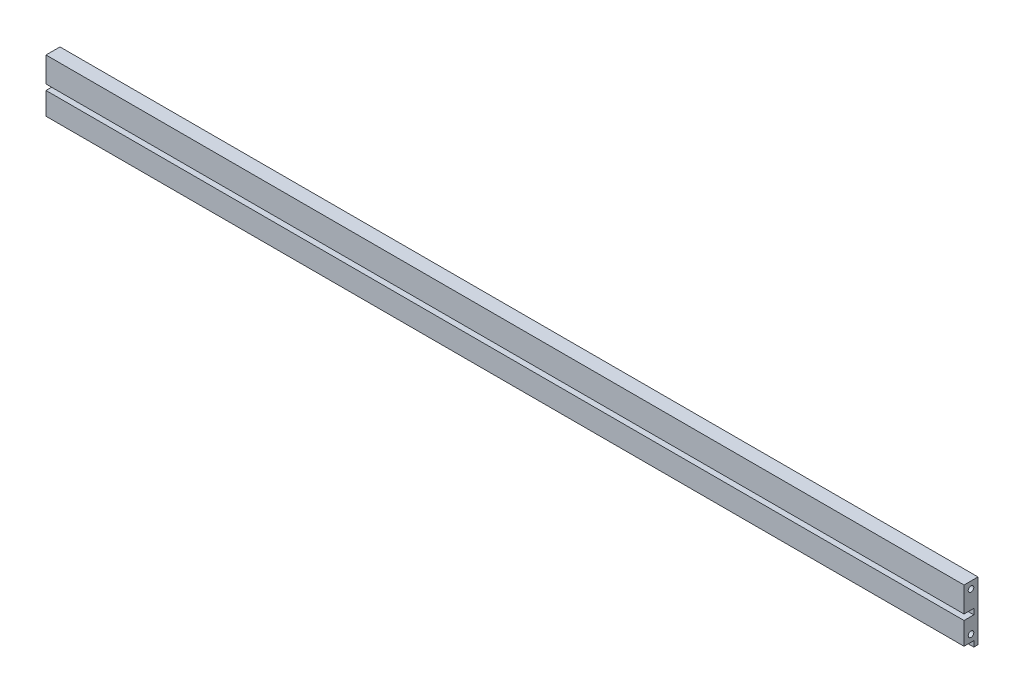
ISO-10303-21;
HEADER;
FILE_DESCRIPTION(('STEP AP214'),'2;1');
FILE_NAME('part.step','',(''),(''),'','','');
FILE_SCHEMA(('AUTOMOTIVE_DESIGN { 1 0 10303 214 1 1 1 1 }'));
ENDSEC;
DATA;
#1=APPLICATION_CONTEXT('core data for automotive mechanical design processes');
#2=APPLICATION_PROTOCOL_DEFINITION('international standard','automotive_design',2000,#1);
#3=PRODUCT_CONTEXT('',#1,'mechanical');
#4=PRODUCT('Part','Part','',(#3));
#5=PRODUCT_RELATED_PRODUCT_CATEGORY('part','',(#4));
#6=PRODUCT_DEFINITION_FORMATION('','',#4);
#7=PRODUCT_DEFINITION_CONTEXT('part definition',#1,'design');
#8=PRODUCT_DEFINITION('design','',#6,#7);
#9=PRODUCT_DEFINITION_SHAPE('','',#8);
#10=(LENGTH_UNIT() NAMED_UNIT(*) SI_UNIT(.MILLI.,.METRE.));
#11=(NAMED_UNIT(*) PLANE_ANGLE_UNIT() SI_UNIT($,.RADIAN.));
#12=(NAMED_UNIT(*) SI_UNIT($,.STERADIAN.) SOLID_ANGLE_UNIT());
#13=UNCERTAINTY_MEASURE_WITH_UNIT(LENGTH_MEASURE(1.E-05),#10,'distance_accuracy_value','');
#14=(GEOMETRIC_REPRESENTATION_CONTEXT(3) GLOBAL_UNCERTAINTY_ASSIGNED_CONTEXT((#13)) GLOBAL_UNIT_ASSIGNED_CONTEXT((#10,
#11,#12)) REPRESENTATION_CONTEXT('',''));
#15=CARTESIAN_POINT('',(0.,0.,0.));
#16=DIRECTION('',(0.,0.,1.));
#17=DIRECTION('',(1.,0.,0.));
#18=AXIS2_PLACEMENT_3D('',#15,#16,#17);
#19=CARTESIAN_POINT('',(47.3976987770359,-23.4062620209755,10.));
#20=DIRECTION('',(0.,1.,0.));
#21=DIRECTION('',(-1.,0.,0.));
#22=AXIS2_PLACEMENT_3D('',#19,#20,#21);
#23=PLANE('',#22);
#24=DIRECTION('',(1.,0.,0.));
#25=VECTOR('',#24,1.);
#26=CARTESIAN_POINT('',(-609.602301222964,-23.4062620209755,3.));
#27=LINE('',#26,#25);
#28=CARTESIAN_POINT('',(-609.602301222964,-23.4062620209755,3.));
#29=VERTEX_POINT('',#28);
#30=CARTESIAN_POINT('',(47.3976987770359,-23.4062620209755,3.));
#31=VERTEX_POINT('',#30);
#32=EDGE_CURVE('E121',#29,#31,#27,.T.);
#33=ORIENTED_EDGE('',*,*,#32,.F.);
#34=DIRECTION('',(0.,0.,-1.));
#35=VECTOR('',#34,1.);
#36=CARTESIAN_POINT('',(-609.602301222964,-23.4062620209755,10.));
#37=LINE('',#36,#35);
#38=CARTESIAN_POINT('',(-609.602301222964,-23.4062620209755,0.));
#39=VERTEX_POINT('',#38);
#40=EDGE_CURVE('E133',#29,#39,#37,.T.);
#41=ORIENTED_EDGE('',*,*,#40,.T.);
#42=DIRECTION('',(1.,0.,0.));
#43=VECTOR('',#42,1.);
#44=CARTESIAN_POINT('',(47.3976987770359,-23.4062620209755,0.));
#45=LINE('',#44,#43);
#46=CARTESIAN_POINT('',(47.3976987770359,-23.4062620209755,0.));
#47=VERTEX_POINT('',#46);
#48=EDGE_CURVE('E151',#39,#47,#45,.T.);
#49=ORIENTED_EDGE('',*,*,#48,.T.);
#50=DIRECTION('',(0.,0.,-1.));
#51=VECTOR('',#50,1.);
#52=CARTESIAN_POINT('',(47.3976987770359,-23.4062620209755,10.));
#53=LINE('',#52,#51);
#54=EDGE_CURVE('E135',#31,#47,#53,.T.);
#55=ORIENTED_EDGE('',*,*,#54,.F.);
#56=EDGE_LOOP('',(#33,#41,#49,#55));
#57=FACE_BOUND('',#56,.T.);
#58=ADVANCED_FACE('F39',(#57),#23,.F.);
#59=CARTESIAN_POINT('',(0.,0.,10.));
#60=DIRECTION('',(0.,0.,-1.));
#61=DIRECTION('',(-1.,0.,0.));
#62=AXIS2_PLACEMENT_3D('',#59,#60,#61);
#63=PLANE('',#62);
#64=DIRECTION('',(0.,-1.,0.));
#65=VECTOR('',#64,1.);
#66=CARTESIAN_POINT('',(-609.602301222964,18.5937379790245,10.));
#67=LINE('',#66,#65);
#68=CARTESIAN_POINT('',(-609.602301222964,18.5937379790245,10.));
#69=VERTEX_POINT('',#68);
#70=CARTESIAN_POINT('',(-609.602301222964,0.593737979024539,10.));
#71=VERTEX_POINT('',#70);
#72=EDGE_CURVE('E148',#69,#71,#67,.T.);
#73=ORIENTED_EDGE('',*,*,#72,.T.);
#74=DIRECTION('',(-1.,0.,0.));
#75=VECTOR('',#74,1.);
#76=CARTESIAN_POINT('',(-609.602301222964,0.593737979024539,10.));
#77=LINE('',#76,#75);
#78=CARTESIAN_POINT('',(47.3976987770359,0.593737979024539,10.));
#79=VERTEX_POINT('',#78);
#80=EDGE_CURVE('E189',#79,#71,#77,.T.);
#81=ORIENTED_EDGE('',*,*,#80,.F.);
#82=DIRECTION('',(0.,1.,0.));
#83=VECTOR('',#82,1.);
#84=CARTESIAN_POINT('',(47.3976987770359,18.5937379790245,10.));
#85=LINE('',#84,#83);
#86=CARTESIAN_POINT('',(47.3976987770359,18.5937379790245,10.));
#87=VERTEX_POINT('',#86);
#88=EDGE_CURVE('E154',#79,#87,#85,.T.);
#89=ORIENTED_EDGE('',*,*,#88,.T.);
#90=DIRECTION('',(-1.,0.,0.));
#91=VECTOR('',#90,1.);
#92=CARTESIAN_POINT('',(47.3976987770359,18.5937379790245,10.));
#93=LINE('',#92,#91);
#94=EDGE_CURVE('E169',#87,#69,#93,.T.);
#95=ORIENTED_EDGE('',*,*,#94,.T.);
#96=EDGE_LOOP('',(#73,#81,#89,#95));
#97=FACE_BOUND('',#96,.T.);
#98=ADVANCED_FACE('F312',(#97),#63,.F.);
#99=CARTESIAN_POINT('',(47.3976987770359,18.5937379790245,10.));
#100=DIRECTION('',(-1.,0.,0.));
#101=DIRECTION('',(0.,0.,1.));
#102=AXIS2_PLACEMENT_3D('',#99,#100,#101);
#103=PLANE('',#102);
#104=CARTESIAN_POINT('',(47.3976987770359,13.5937379790245,5.));
#105=DIRECTION('',(1.,0.,0.));
#106=DIRECTION('',(0.,0.,-1.));
#107=AXIS2_PLACEMENT_3D('',#104,#105,#106);
#108=CIRCLE('',#107,2.);
#109=CARTESIAN_POINT('',(47.3976987770359,13.5937379790245,3.));
#110=VERTEX_POINT('',#109);
#111=EDGE_CURVE('E245',#110,#110,#108,.T.);
#112=ORIENTED_EDGE('',*,*,#111,.F.);
#113=EDGE_LOOP('',(#112));
#114=FACE_BOUND('',#113,.T.);
#115=CARTESIAN_POINT('',(47.3976987770359,-14.4062620209755,5.));
#116=DIRECTION('',(1.,0.,0.));
#117=DIRECTION('',(0.,0.,-1.));
#118=AXIS2_PLACEMENT_3D('',#115,#116,#117);
#119=CIRCLE('',#118,2.);
#120=CARTESIAN_POINT('',(47.3976987770359,-14.4062620209755,3.));
#121=VERTEX_POINT('',#120);
#122=EDGE_CURVE('E236',#121,#121,#119,.T.);
#123=ORIENTED_EDGE('',*,*,#122,.F.);
#124=EDGE_LOOP('',(#123));
#125=FACE_BOUND('',#124,.T.);
#126=CARTESIAN_POINT('',(47.3976987770359,-19.4062620209755,10.));
#127=VERTEX_POINT('',#126);
#128=CARTESIAN_POINT('',(47.3976987770359,-3.40626202097546,10.));
#129=VERTEX_POINT('',#128);
#130=EDGE_CURVE('E172',#127,#129,#85,.T.);
#131=ORIENTED_EDGE('',*,*,#130,.F.);
#132=DIRECTION('',(0.,0.,1.));
#133=VECTOR('',#132,1.);
#134=CARTESIAN_POINT('',(47.3976987770359,-19.4062620209755,3.));
#135=LINE('',#134,#133);
#136=CARTESIAN_POINT('',(47.3976987770359,-19.4062620209755,3.));
#137=VERTEX_POINT('',#136);
#138=EDGE_CURVE('E63',#137,#127,#135,.T.);
#139=ORIENTED_EDGE('',*,*,#138,.F.);
#140=DIRECTION('',(0.,1.,0.));
#141=VECTOR('',#140,1.);
#142=CARTESIAN_POINT('',(47.3976987770359,-19.4062620209755,3.));
#143=LINE('',#142,#141);
#144=EDGE_CURVE('E137',#31,#137,#143,.T.);
#145=ORIENTED_EDGE('',*,*,#144,.F.);
#146=ORIENTED_EDGE('',*,*,#54,.T.);
#147=DIRECTION('',(0.,1.,0.));
#148=VECTOR('',#147,1.);
#149=CARTESIAN_POINT('',(47.3976987770359,18.5937379790245,0.));
#150=LINE('',#149,#148);
#151=CARTESIAN_POINT('',(47.3976987770359,18.5937379790245,0.));
#152=VERTEX_POINT('',#151);
#153=EDGE_CURVE('E160',#47,#152,#150,.T.);
#154=ORIENTED_EDGE('',*,*,#153,.T.);
#155=DIRECTION('',(0.,0.,-1.));
#156=VECTOR('',#155,1.);
#157=CARTESIAN_POINT('',(47.3976987770359,18.5937379790245,10.));
#158=LINE('',#157,#156);
#159=EDGE_CURVE('E11',#87,#152,#158,.T.);
#160=ORIENTED_EDGE('',*,*,#159,.F.);
#161=ORIENTED_EDGE('',*,*,#88,.F.);
#162=DIRECTION('',(0.,0.,1.));
#163=VECTOR('',#162,1.);
#164=CARTESIAN_POINT('',(47.3976987770359,0.593737979024539,3.));
#165=LINE('',#164,#163);
#166=CARTESIAN_POINT('',(47.3976987770359,0.593737979024539,3.));
#167=VERTEX_POINT('',#166);
#168=EDGE_CURVE('E182',#167,#79,#165,.T.);
#169=ORIENTED_EDGE('',*,*,#168,.F.);
#170=DIRECTION('',(0.,1.,0.));
#171=VECTOR('',#170,1.);
#172=CARTESIAN_POINT('',(47.3976987770359,-3.40626202097546,3.));
#173=LINE('',#172,#171);
#174=CARTESIAN_POINT('',(47.3976987770359,-3.40626202097546,3.));
#175=VERTEX_POINT('',#174);
#176=EDGE_CURVE('E200',#175,#167,#173,.T.);
#177=ORIENTED_EDGE('',*,*,#176,.F.);
#178=DIRECTION('',(0.,0.,1.));
#179=VECTOR('',#178,1.);
#180=CARTESIAN_POINT('',(47.3976987770359,-3.40626202097546,3.));
#181=LINE('',#180,#179);
#182=EDGE_CURVE('E177',#175,#129,#181,.T.);
#183=ORIENTED_EDGE('',*,*,#182,.T.);
#184=EDGE_LOOP('',(#131,#139,#145,#146,#154,#160,#161,#169,#177,#183));
#185=FACE_BOUND('',#184,.T.);
#186=ADVANCED_FACE('F41',(#114,#125,#185),#103,.F.);
#187=CARTESIAN_POINT('',(47.3976987770359,18.5937379790245,10.));
#188=DIRECTION('',(0.,-1.,0.));
#189=DIRECTION('',(1.,0.,0.));
#190=AXIS2_PLACEMENT_3D('',#187,#188,#189);
#191=PLANE('',#190);
#192=DIRECTION('',(-1.,0.,0.));
#193=VECTOR('',#192,1.);
#194=CARTESIAN_POINT('',(47.3976987770359,18.5937379790245,0.));
#195=LINE('',#194,#193);
#196=CARTESIAN_POINT('',(-609.602301222964,18.5937379790245,0.));
#197=VERTEX_POINT('',#196);
#198=EDGE_CURVE('E157',#152,#197,#195,.T.);
#199=ORIENTED_EDGE('',*,*,#198,.T.);
#200=DIRECTION('',(0.,0.,-1.));
#201=VECTOR('',#200,1.);
#202=CARTESIAN_POINT('',(-609.602301222964,18.5937379790245,10.));
#203=LINE('',#202,#201);
#204=EDGE_CURVE('E48',#69,#197,#203,.T.);
#205=ORIENTED_EDGE('',*,*,#204,.F.);
#206=ORIENTED_EDGE('',*,*,#94,.F.);
#207=ORIENTED_EDGE('',*,*,#159,.T.);
#208=EDGE_LOOP('',(#199,#205,#206,#207));
#209=FACE_BOUND('',#208,.T.);
#210=ADVANCED_FACE('F318',(#209),#191,.F.);
#211=CARTESIAN_POINT('',(-609.602301222964,18.5937379790245,10.));
#212=DIRECTION('',(1.,0.,0.));
#213=DIRECTION('',(0.,0.,-1.));
#214=AXIS2_PLACEMENT_3D('',#211,#212,#213);
#215=PLANE('',#214);
#216=CARTESIAN_POINT('',(-609.602301222964,13.5937379790245,5.));
#217=DIRECTION('',(-1.,0.,0.));
#218=DIRECTION('',(0.,0.,1.));
#219=AXIS2_PLACEMENT_3D('',#216,#217,#218);
#220=CIRCLE('',#219,2.);
#221=CARTESIAN_POINT('',(-609.602301222964,13.5937379790245,7.));
#222=VERTEX_POINT('',#221);
#223=EDGE_CURVE('E229',#222,#222,#220,.T.);
#224=ORIENTED_EDGE('',*,*,#223,.F.);
#225=EDGE_LOOP('',(#224));
#226=FACE_BOUND('',#225,.T.);
#227=CARTESIAN_POINT('',(-609.602301222964,-14.4062620209755,5.));
#228=DIRECTION('',(-1.,0.,0.));
#229=DIRECTION('',(0.,0.,1.));
#230=AXIS2_PLACEMENT_3D('',#227,#228,#229);
#231=CIRCLE('',#230,2.);
#232=CARTESIAN_POINT('',(-609.602301222964,-14.4062620209755,7.));
#233=VERTEX_POINT('',#232);
#234=EDGE_CURVE('E220',#233,#233,#231,.T.);
#235=ORIENTED_EDGE('',*,*,#234,.F.);
#236=EDGE_LOOP('',(#235));
#237=FACE_BOUND('',#236,.T.);
#238=DIRECTION('',(0.,-1.,0.));
#239=VECTOR('',#238,1.);
#240=CARTESIAN_POINT('',(-609.602301222964,-19.4062620209755,3.));
#241=LINE('',#240,#239);
#242=CARTESIAN_POINT('',(-609.602301222964,-19.4062620209755,3.));
#243=VERTEX_POINT('',#242);
#244=EDGE_CURVE('E118',#243,#29,#241,.T.);
#245=ORIENTED_EDGE('',*,*,#244,.F.);
#246=DIRECTION('',(0.,0.,1.));
#247=VECTOR('',#246,1.);
#248=CARTESIAN_POINT('',(-609.602301222964,-19.4062620209755,3.));
#249=LINE('',#248,#247);
#250=CARTESIAN_POINT('',(-609.602301222964,-19.4062620209755,10.));
#251=VERTEX_POINT('',#250);
#252=EDGE_CURVE('E164',#243,#251,#249,.T.);
#253=ORIENTED_EDGE('',*,*,#252,.T.);
#254=CARTESIAN_POINT('',(-609.602301222964,-3.40626202097546,10.));
#255=VERTEX_POINT('',#254);
#256=EDGE_CURVE('E168',#255,#251,#67,.T.);
#257=ORIENTED_EDGE('',*,*,#256,.F.);
#258=DIRECTION('',(0.,0.,1.));
#259=VECTOR('',#258,1.);
#260=CARTESIAN_POINT('',(-609.602301222964,-3.40626202097546,3.));
#261=LINE('',#260,#259);
#262=CARTESIAN_POINT('',(-609.602301222964,-3.40626202097546,3.));
#263=VERTEX_POINT('',#262);
#264=EDGE_CURVE('E55',#263,#255,#261,.T.);
#265=ORIENTED_EDGE('',*,*,#264,.F.);
#266=DIRECTION('',(0.,-1.,0.));
#267=VECTOR('',#266,1.);
#268=CARTESIAN_POINT('',(-609.602301222964,-3.40626202097546,3.));
#269=LINE('',#268,#267);
#270=CARTESIAN_POINT('',(-609.602301222964,0.593737979024539,3.));
#271=VERTEX_POINT('',#270);
#272=EDGE_CURVE('E192',#271,#263,#269,.T.);
#273=ORIENTED_EDGE('',*,*,#272,.F.);
#274=DIRECTION('',(0.,0.,1.));
#275=VECTOR('',#274,1.);
#276=CARTESIAN_POINT('',(-609.602301222964,0.593737979024539,3.));
#277=LINE('',#276,#275);
#278=EDGE_CURVE('E185',#271,#71,#277,.T.);
#279=ORIENTED_EDGE('',*,*,#278,.T.);
#280=ORIENTED_EDGE('',*,*,#72,.F.);
#281=ORIENTED_EDGE('',*,*,#204,.T.);
#282=DIRECTION('',(0.,-1.,0.));
#283=VECTOR('',#282,1.);
#284=CARTESIAN_POINT('',(-609.602301222964,18.5937379790245,0.));
#285=LINE('',#284,#283);
#286=EDGE_CURVE('E142',#197,#39,#285,.T.);
#287=ORIENTED_EDGE('',*,*,#286,.T.);
#288=ORIENTED_EDGE('',*,*,#40,.F.);
#289=EDGE_LOOP('',(#245,#253,#257,#265,#273,#279,#280,#281,#287,#288));
#290=FACE_BOUND('',#289,.T.);
#291=ADVANCED_FACE('F139',(#226,#237,#290),#215,.F.);
#292=ORIENTED_EDGE('',*,*,#256,.T.);
#293=DIRECTION('',(-1.,0.,0.));
#294=VECTOR('',#293,1.);
#295=CARTESIAN_POINT('',(-609.602301222964,-19.4062620209755,10.));
#296=LINE('',#295,#294);
#297=EDGE_CURVE('E128',#127,#251,#296,.T.);
#298=ORIENTED_EDGE('',*,*,#297,.F.);
#299=ORIENTED_EDGE('',*,*,#130,.T.);
#300=DIRECTION('',(1.,0.,0.));
#301=VECTOR('',#300,1.);
#302=CARTESIAN_POINT('',(-609.602301222964,-3.40626202097546,10.));
#303=LINE('',#302,#301);
#304=EDGE_CURVE('E193',#255,#129,#303,.T.);
#305=ORIENTED_EDGE('',*,*,#304,.F.);
#306=EDGE_LOOP('',(#292,#298,#299,#305));
#307=FACE_BOUND('',#306,.T.);
#308=ADVANCED_FACE('F298',(#307),#63,.F.);
#309=CARTESIAN_POINT('',(0.,0.,0.));
#310=DIRECTION('',(0.,0.,-1.));
#311=DIRECTION('',(-1.,0.,0.));
#312=AXIS2_PLACEMENT_3D('',#309,#310,#311);
#313=PLANE('',#312);
#314=ORIENTED_EDGE('',*,*,#153,.F.);
#315=ORIENTED_EDGE('',*,*,#48,.F.);
#316=ORIENTED_EDGE('',*,*,#286,.F.);
#317=ORIENTED_EDGE('',*,*,#198,.F.);
#318=EDGE_LOOP('',(#314,#315,#316,#317));
#319=FACE_BOUND('',#318,.T.);
#320=ADVANCED_FACE('F321',(#319),#313,.T.);
#321=CARTESIAN_POINT('',(-609.602301222964,0.593737979024539,3.));
#322=DIRECTION('',(0.,1.,0.));
#323=DIRECTION('',(0.,0.,1.));
#324=AXIS2_PLACEMENT_3D('',#321,#322,#323);
#325=PLANE('',#324);
#326=ORIENTED_EDGE('',*,*,#80,.T.);
#327=ORIENTED_EDGE('',*,*,#278,.F.);
#328=DIRECTION('',(-1.,0.,0.));
#329=VECTOR('',#328,1.);
#330=CARTESIAN_POINT('',(-609.602301222964,0.593737979024539,3.));
#331=LINE('',#330,#329);
#332=EDGE_CURVE('E178',#167,#271,#331,.T.);
#333=ORIENTED_EDGE('',*,*,#332,.F.);
#334=ORIENTED_EDGE('',*,*,#168,.T.);
#335=EDGE_LOOP('',(#326,#327,#333,#334));
#336=FACE_BOUND('',#335,.T.);
#337=ADVANCED_FACE('F322',(#336),#325,.F.);
#338=CARTESIAN_POINT('',(-609.602301222964,-3.40626202097546,3.));
#339=DIRECTION('',(0.,-1.,0.));
#340=DIRECTION('',(0.,0.,-1.));
#341=AXIS2_PLACEMENT_3D('',#338,#339,#340);
#342=PLANE('',#341);
#343=ORIENTED_EDGE('',*,*,#304,.T.);
#344=ORIENTED_EDGE('',*,*,#182,.F.);
#345=DIRECTION('',(1.,0.,0.));
#346=VECTOR('',#345,1.);
#347=CARTESIAN_POINT('',(-609.602301222964,-3.40626202097546,3.));
#348=LINE('',#347,#346);
#349=EDGE_CURVE('E203',#263,#175,#348,.T.);
#350=ORIENTED_EDGE('',*,*,#349,.F.);
#351=ORIENTED_EDGE('',*,*,#264,.T.);
#352=EDGE_LOOP('',(#343,#344,#350,#351));
#353=FACE_BOUND('',#352,.T.);
#354=ADVANCED_FACE('F304',(#353),#342,.F.);
#355=CARTESIAN_POINT('',(0.,0.,3.));
#356=DIRECTION('',(0.,0.,-1.));
#357=DIRECTION('',(-1.,0.,0.));
#358=AXIS2_PLACEMENT_3D('',#355,#356,#357);
#359=PLANE('',#358);
#360=ORIENTED_EDGE('',*,*,#272,.T.);
#361=ORIENTED_EDGE('',*,*,#349,.T.);
#362=ORIENTED_EDGE('',*,*,#176,.T.);
#363=ORIENTED_EDGE('',*,*,#332,.T.);
#364=EDGE_LOOP('',(#360,#361,#362,#363));
#365=FACE_BOUND('',#364,.T.);
#366=ADVANCED_FACE('F288',(#365),#359,.F.);
#367=CARTESIAN_POINT('',(-609.602301222964,-19.4062620209755,3.));
#368=DIRECTION('',(0.,1.,0.));
#369=DIRECTION('',(0.,0.,1.));
#370=AXIS2_PLACEMENT_3D('',#367,#368,#369);
#371=PLANE('',#370);
#372=CARTESIAN_POINT('',(-559.602301222964,-19.4062620209755,6.5));
#373=DIRECTION('',(0.,-1.,0.));
#374=DIRECTION('',(0.,0.,-1.));
#375=AXIS2_PLACEMENT_3D('',#372,#373,#374);
#376=CIRCLE('',#375,1.50000000000008);
#377=CARTESIAN_POINT('',(-559.602301222964,-19.4062620209755,4.99999999999992));
#378=VERTEX_POINT('',#377);
#379=EDGE_CURVE('E268',#378,#378,#376,.T.);
#380=ORIENTED_EDGE('',*,*,#379,.F.);
#381=EDGE_LOOP('',(#380));
#382=FACE_BOUND('',#381,.T.);
#383=CARTESIAN_POINT('',(-2.60230122296408,-19.4062620209755,6.5));
#384=DIRECTION('',(0.,-1.,0.));
#385=DIRECTION('',(0.,0.,-1.));
#386=AXIS2_PLACEMENT_3D('',#383,#384,#385);
#387=CIRCLE('',#386,1.5);
#388=CARTESIAN_POINT('',(-2.60230122296408,-19.4062620209755,5.));
#389=VERTEX_POINT('',#388);
#390=EDGE_CURVE('E260',#389,#389,#387,.T.);
#391=ORIENTED_EDGE('',*,*,#390,.F.);
#392=EDGE_LOOP('',(#391));
#393=FACE_BOUND('',#392,.T.);
#394=CARTESIAN_POINT('',(-281.102301222964,-19.4062620209755,6.5));
#395=DIRECTION('',(0.,-1.,0.));
#396=DIRECTION('',(0.,0.,-1.));
#397=AXIS2_PLACEMENT_3D('',#394,#395,#396);
#398=CIRCLE('',#397,1.50000000000002);
#399=CARTESIAN_POINT('',(-281.102301222964,-19.4062620209755,4.99999999999998));
#400=VERTEX_POINT('',#399);
#401=EDGE_CURVE('E252',#400,#400,#398,.T.);
#402=ORIENTED_EDGE('',*,*,#401,.F.);
#403=EDGE_LOOP('',(#402));
#404=FACE_BOUND('',#403,.T.);
#405=ORIENTED_EDGE('',*,*,#297,.T.);
#406=ORIENTED_EDGE('',*,*,#252,.F.);
#407=DIRECTION('',(-1.,0.,0.));
#408=VECTOR('',#407,1.);
#409=CARTESIAN_POINT('',(-609.602301222964,-19.4062620209755,3.));
#410=LINE('',#409,#408);
#411=EDGE_CURVE('E123',#137,#243,#410,.T.);
#412=ORIENTED_EDGE('',*,*,#411,.F.);
#413=ORIENTED_EDGE('',*,*,#138,.T.);
#414=EDGE_LOOP('',(#405,#406,#412,#413));
#415=FACE_BOUND('',#414,.T.);
#416=ADVANCED_FACE('F285',(#382,#393,#404,#415),#371,.F.);
#417=CARTESIAN_POINT('',(0.,0.,3.));
#418=DIRECTION('',(0.,0.,1.));
#419=DIRECTION('',(1.,0.,0.));
#420=AXIS2_PLACEMENT_3D('',#417,#418,#419);
#421=PLANE('',#420);
#422=ORIENTED_EDGE('',*,*,#244,.T.);
#423=ORIENTED_EDGE('',*,*,#32,.T.);
#424=ORIENTED_EDGE('',*,*,#144,.T.);
#425=ORIENTED_EDGE('',*,*,#411,.T.);
#426=EDGE_LOOP('',(#422,#423,#424,#425));
#427=FACE_BOUND('',#426,.T.);
#428=ADVANCED_FACE('F120',(#427),#421,.T.);
#429=CARTESIAN_POINT('',(-599.602301222964,-14.4062620209755,5.));
#430=DIRECTION('',(-1.,0.,0.));
#431=DIRECTION('',(0.,0.,1.));
#432=AXIS2_PLACEMENT_3D('',#429,#430,#431);
#433=CYLINDRICAL_SURFACE('',#432,2.);
#434=CARTESIAN_POINT('',(-599.602301222964,-14.4062620209755,5.));
#435=DIRECTION('',(-1.,0.,0.));
#436=DIRECTION('',(0.,0.,1.));
#437=AXIS2_PLACEMENT_3D('',#434,#435,#436);
#438=CIRCLE('',#437,2.);
#439=CARTESIAN_POINT('',(-599.602301222964,-14.4062620209755,7.));
#440=VERTEX_POINT('',#439);
#441=EDGE_CURVE('E224',#440,#440,#438,.T.);
#442=ORIENTED_EDGE('',*,*,#441,.F.);
#443=EDGE_LOOP('',(#442));
#444=FACE_BOUND('',#443,.T.);
#445=ORIENTED_EDGE('',*,*,#234,.T.);
#446=EDGE_LOOP('',(#445));
#447=FACE_BOUND('',#446,.T.);
#448=ADVANCED_FACE('F377',(#444,#447),#433,.F.);
#449=CARTESIAN_POINT('',(-599.602301222964,-14.4062620209755,5.));
#450=DIRECTION('',(-1.,0.,0.));
#451=DIRECTION('',(0.,0.,1.));
#452=AXIS2_PLACEMENT_3D('',#449,#450,#451);
#453=PLANE('',#452);
#454=ORIENTED_EDGE('',*,*,#441,.T.);
#455=EDGE_LOOP('',(#454));
#456=FACE_BOUND('',#455,.T.);
#457=ADVANCED_FACE('F373',(#456),#453,.T.);
#458=CARTESIAN_POINT('',(-599.602301222964,13.5937379790245,5.));
#459=DIRECTION('',(-1.,0.,0.));
#460=DIRECTION('',(0.,0.,1.));
#461=AXIS2_PLACEMENT_3D('',#458,#459,#460);
#462=CYLINDRICAL_SURFACE('',#461,2.);
#463=CARTESIAN_POINT('',(-599.602301222964,13.5937379790245,5.));
#464=DIRECTION('',(-1.,0.,0.));
#465=DIRECTION('',(0.,0.,1.));
#466=AXIS2_PLACEMENT_3D('',#463,#464,#465);
#467=CIRCLE('',#466,2.);
#468=CARTESIAN_POINT('',(-599.602301222964,13.5937379790245,7.));
#469=VERTEX_POINT('',#468);
#470=EDGE_CURVE('E196',#469,#469,#467,.T.);
#471=ORIENTED_EDGE('',*,*,#470,.F.);
#472=EDGE_LOOP('',(#471));
#473=FACE_BOUND('',#472,.T.);
#474=ORIENTED_EDGE('',*,*,#223,.T.);
#475=EDGE_LOOP('',(#474));
#476=FACE_BOUND('',#475,.T.);
#477=ADVANCED_FACE('F365',(#473,#476),#462,.F.);
#478=CARTESIAN_POINT('',(-599.602301222964,13.5937379790245,5.));
#479=DIRECTION('',(-1.,0.,0.));
#480=DIRECTION('',(0.,0.,1.));
#481=AXIS2_PLACEMENT_3D('',#478,#479,#480);
#482=PLANE('',#481);
#483=ORIENTED_EDGE('',*,*,#470,.T.);
#484=EDGE_LOOP('',(#483));
#485=FACE_BOUND('',#484,.T.);
#486=ADVANCED_FACE('F355',(#485),#482,.T.);
#487=CARTESIAN_POINT('',(37.3976987770359,-14.4062620209755,5.));
#488=DIRECTION('',(1.,0.,0.));
#489=DIRECTION('',(0.,0.,-1.));
#490=AXIS2_PLACEMENT_3D('',#487,#488,#489);
#491=CYLINDRICAL_SURFACE('',#490,2.);
#492=CARTESIAN_POINT('',(37.3976987770359,-14.4062620209755,5.));
#493=DIRECTION('',(1.,0.,0.));
#494=DIRECTION('',(0.,0.,-1.));
#495=AXIS2_PLACEMENT_3D('',#492,#493,#494);
#496=CIRCLE('',#495,2.);
#497=CARTESIAN_POINT('',(37.3976987770359,-14.4062620209755,3.));
#498=VERTEX_POINT('',#497);
#499=EDGE_CURVE('E240',#498,#498,#496,.T.);
#500=ORIENTED_EDGE('',*,*,#499,.F.);
#501=EDGE_LOOP('',(#500));
#502=FACE_BOUND('',#501,.T.);
#503=ORIENTED_EDGE('',*,*,#122,.T.);
#504=EDGE_LOOP('',(#503));
#505=FACE_BOUND('',#504,.T.);
#506=ADVANCED_FACE('F352',(#502,#505),#491,.F.);
#507=CARTESIAN_POINT('',(37.3976987770359,-14.4062620209755,5.));
#508=DIRECTION('',(1.,0.,0.));
#509=DIRECTION('',(0.,0.,-1.));
#510=AXIS2_PLACEMENT_3D('',#507,#508,#509);
#511=PLANE('',#510);
#512=ORIENTED_EDGE('',*,*,#499,.T.);
#513=EDGE_LOOP('',(#512));
#514=FACE_BOUND('',#513,.T.);
#515=ADVANCED_FACE('F354',(#514),#511,.T.);
#516=CARTESIAN_POINT('',(37.3976987770359,13.5937379790245,5.));
#517=DIRECTION('',(1.,0.,0.));
#518=DIRECTION('',(0.,0.,-1.));
#519=AXIS2_PLACEMENT_3D('',#516,#517,#518);
#520=CYLINDRICAL_SURFACE('',#519,2.);
#521=CARTESIAN_POINT('',(37.3976987770359,13.5937379790245,5.));
#522=DIRECTION('',(1.,0.,0.));
#523=DIRECTION('',(0.,0.,-1.));
#524=AXIS2_PLACEMENT_3D('',#521,#522,#523);
#525=CIRCLE('',#524,2.);
#526=CARTESIAN_POINT('',(37.3976987770359,13.5937379790245,3.));
#527=VERTEX_POINT('',#526);
#528=EDGE_CURVE('E225',#527,#527,#525,.T.);
#529=ORIENTED_EDGE('',*,*,#528,.F.);
#530=EDGE_LOOP('',(#529));
#531=FACE_BOUND('',#530,.T.);
#532=ORIENTED_EDGE('',*,*,#111,.T.);
#533=EDGE_LOOP('',(#532));
#534=FACE_BOUND('',#533,.T.);
#535=ADVANCED_FACE('F362',(#531,#534),#520,.F.);
#536=CARTESIAN_POINT('',(37.3976987770359,13.5937379790245,5.));
#537=DIRECTION('',(1.,0.,0.));
#538=DIRECTION('',(0.,0.,-1.));
#539=AXIS2_PLACEMENT_3D('',#536,#537,#538);
#540=PLANE('',#539);
#541=ORIENTED_EDGE('',*,*,#528,.T.);
#542=EDGE_LOOP('',(#541));
#543=FACE_BOUND('',#542,.T.);
#544=ADVANCED_FACE('F438',(#543),#540,.T.);
#545=CARTESIAN_POINT('',(-281.102301222964,-7.40626202097547,6.5));
#546=DIRECTION('',(0.,-1.,0.));
#547=DIRECTION('',(0.,0.,-1.));
#548=AXIS2_PLACEMENT_3D('',#545,#546,#547);
#549=CYLINDRICAL_SURFACE('',#548,1.50000000000002);
#550=CARTESIAN_POINT('',(-281.102301222964,-7.40626202097547,6.5));
#551=DIRECTION('',(0.,-1.,0.));
#552=DIRECTION('',(0.,0.,-1.));
#553=AXIS2_PLACEMENT_3D('',#550,#551,#552);
#554=CIRCLE('',#553,1.50000000000002);
#555=CARTESIAN_POINT('',(-281.102301222964,-7.40626202097547,4.99999999999998));
#556=VERTEX_POINT('',#555);
#557=EDGE_CURVE('E256',#556,#556,#554,.T.);
#558=ORIENTED_EDGE('',*,*,#557,.F.);
#559=EDGE_LOOP('',(#558));
#560=FACE_BOUND('',#559,.T.);
#561=ORIENTED_EDGE('',*,*,#401,.T.);
#562=EDGE_LOOP('',(#561));
#563=FACE_BOUND('',#562,.T.);
#564=ADVANCED_FACE('F446',(#560,#563),#549,.F.);
#565=CARTESIAN_POINT('',(-281.102301222964,-7.40626202097547,6.5));
#566=DIRECTION('',(0.,-1.,0.));
#567=DIRECTION('',(0.,0.,-1.));
#568=AXIS2_PLACEMENT_3D('',#565,#566,#567);
#569=PLANE('',#568);
#570=ORIENTED_EDGE('',*,*,#557,.T.);
#571=EDGE_LOOP('',(#570));
#572=FACE_BOUND('',#571,.T.);
#573=ADVANCED_FACE('F456',(#572),#569,.T.);
#574=CARTESIAN_POINT('',(-2.60230122296408,-7.40626202097547,6.5));
#575=DIRECTION('',(0.,-1.,0.));
#576=DIRECTION('',(0.,0.,-1.));
#577=AXIS2_PLACEMENT_3D('',#574,#575,#576);
#578=CYLINDRICAL_SURFACE('',#577,1.5);
#579=CARTESIAN_POINT('',(-2.60230122296408,-7.40626202097547,6.5));
#580=DIRECTION('',(0.,-1.,0.));
#581=DIRECTION('',(0.,0.,-1.));
#582=AXIS2_PLACEMENT_3D('',#579,#580,#581);
#583=CIRCLE('',#582,1.5);
#584=CARTESIAN_POINT('',(-2.60230122296408,-7.40626202097547,5.));
#585=VERTEX_POINT('',#584);
#586=EDGE_CURVE('E264',#585,#585,#583,.T.);
#587=ORIENTED_EDGE('',*,*,#586,.F.);
#588=EDGE_LOOP('',(#587));
#589=FACE_BOUND('',#588,.T.);
#590=ORIENTED_EDGE('',*,*,#390,.T.);
#591=EDGE_LOOP('',(#590));
#592=FACE_BOUND('',#591,.T.);
#593=ADVANCED_FACE('F463',(#589,#592),#578,.F.);
#594=CARTESIAN_POINT('',(-2.60230122296408,-7.40626202097547,6.5));
#595=DIRECTION('',(0.,-1.,0.));
#596=DIRECTION('',(0.,0.,-1.));
#597=AXIS2_PLACEMENT_3D('',#594,#595,#596);
#598=PLANE('',#597);
#599=ORIENTED_EDGE('',*,*,#586,.T.);
#600=EDGE_LOOP('',(#599));
#601=FACE_BOUND('',#600,.T.);
#602=ADVANCED_FACE('F281',(#601),#598,.T.);
#603=CARTESIAN_POINT('',(-559.602301222964,-7.40626202097547,6.5));
#604=DIRECTION('',(0.,-1.,0.));
#605=DIRECTION('',(0.,0.,-1.));
#606=AXIS2_PLACEMENT_3D('',#603,#604,#605);
#607=CYLINDRICAL_SURFACE('',#606,1.50000000000008);
#608=CARTESIAN_POINT('',(-559.602301222964,-7.40626202097547,6.5));
#609=DIRECTION('',(0.,-1.,0.));
#610=DIRECTION('',(0.,0.,-1.));
#611=AXIS2_PLACEMENT_3D('',#608,#609,#610);
#612=CIRCLE('',#611,1.50000000000008);
#613=CARTESIAN_POINT('',(-559.602301222964,-7.40626202097547,4.99999999999992));
#614=VERTEX_POINT('',#613);
#615=EDGE_CURVE('E241',#614,#614,#612,.T.);
#616=ORIENTED_EDGE('',*,*,#615,.F.);
#617=EDGE_LOOP('',(#616));
#618=FACE_BOUND('',#617,.T.);
#619=ORIENTED_EDGE('',*,*,#379,.T.);
#620=EDGE_LOOP('',(#619));
#621=FACE_BOUND('',#620,.T.);
#622=ADVANCED_FACE('F278',(#618,#621),#607,.F.);
#623=CARTESIAN_POINT('',(-559.602301222964,-7.40626202097547,6.5));
#624=DIRECTION('',(0.,-1.,0.));
#625=DIRECTION('',(0.,0.,-1.));
#626=AXIS2_PLACEMENT_3D('',#623,#624,#625);
#627=PLANE('',#626);
#628=ORIENTED_EDGE('',*,*,#615,.T.);
#629=EDGE_LOOP('',(#628));
#630=FACE_BOUND('',#629,.T.);
#631=ADVANCED_FACE('F276',(#630),#627,.T.);
#632=CLOSED_SHELL('',(#58,#98,#186,#210,#291,#308,#320,#337,#354,#366,#416,#428,#448,#457,#477,
#486,#506,#515,#535,#544,#564,#573,#593,#602,#622,#631));
#633=MANIFOLD_SOLID_BREP('B2',#632);
#634=ADVANCED_BREP_SHAPE_REPRESENTATION('',(#18,#633),#14);
#635=SHAPE_DEFINITION_REPRESENTATION(#9,#634);
ENDSEC;
END-ISO-10303-21;
